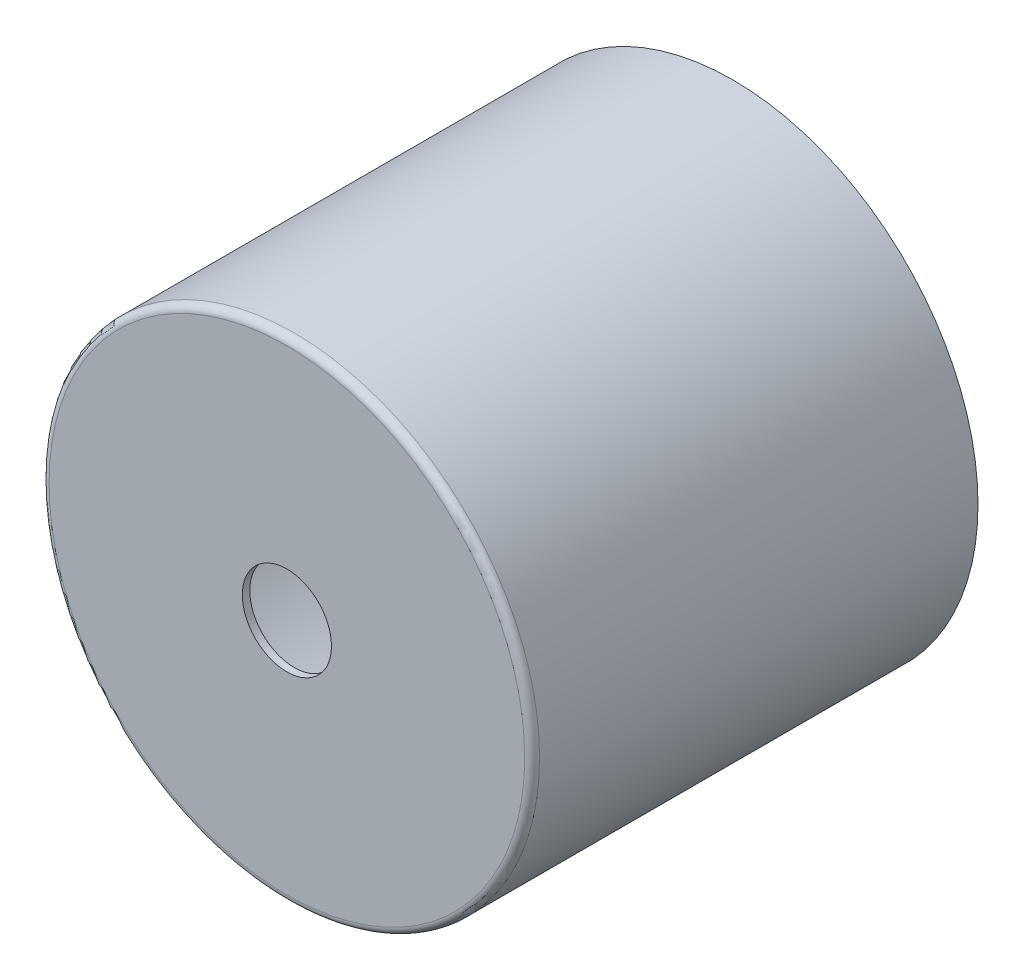
ISO-10303-21;
HEADER;
FILE_DESCRIPTION(('STEP AP214'),'2;1');
FILE_NAME('part.step','',(''),(''),'','','');
FILE_SCHEMA(('AUTOMOTIVE_DESIGN { 1 0 10303 214 1 1 1 1 }'));
ENDSEC;
DATA;
#1=APPLICATION_CONTEXT('core data for automotive mechanical design processes');
#2=APPLICATION_PROTOCOL_DEFINITION('international standard','automotive_design',2000,#1);
#3=PRODUCT_CONTEXT('',#1,'mechanical');
#4=PRODUCT('Part','Part','',(#3));
#5=PRODUCT_RELATED_PRODUCT_CATEGORY('part','',(#4));
#6=PRODUCT_DEFINITION_FORMATION('','',#4);
#7=PRODUCT_DEFINITION_CONTEXT('part definition',#1,'design');
#8=PRODUCT_DEFINITION('design','',#6,#7);
#9=PRODUCT_DEFINITION_SHAPE('','',#8);
#10=(LENGTH_UNIT() NAMED_UNIT(*) SI_UNIT(.MILLI.,.METRE.));
#11=(NAMED_UNIT(*) PLANE_ANGLE_UNIT() SI_UNIT($,.RADIAN.));
#12=(NAMED_UNIT(*) SI_UNIT($,.STERADIAN.) SOLID_ANGLE_UNIT());
#13=UNCERTAINTY_MEASURE_WITH_UNIT(LENGTH_MEASURE(1.E-05),#10,'distance_accuracy_value','');
#14=(GEOMETRIC_REPRESENTATION_CONTEXT(3) GLOBAL_UNCERTAINTY_ASSIGNED_CONTEXT((#13)) GLOBAL_UNIT_ASSIGNED_CONTEXT((#10,
#11,#12)) REPRESENTATION_CONTEXT('',''));
#15=CARTESIAN_POINT('',(0.,0.,0.));
#16=DIRECTION('',(0.,0.,1.));
#17=DIRECTION('',(1.,0.,0.));
#18=AXIS2_PLACEMENT_3D('',#15,#16,#17);
#19=CARTESIAN_POINT('',(0.,0.,-30.));
#20=DIRECTION('',(0.,0.,1.));
#21=DIRECTION('',(1.,0.,0.));
#22=AXIS2_PLACEMENT_3D('',#19,#20,#21);
#23=CYLINDRICAL_SURFACE('',#22,16.5);
#24=CARTESIAN_POINT('',(0.,0.,-0.5));
#25=DIRECTION('',(0.,0.,1.));
#26=DIRECTION('',(1.,0.,0.));
#27=AXIS2_PLACEMENT_3D('',#24,#25,#26);
#28=CIRCLE('',#27,16.5);
#29=CARTESIAN_POINT('',(16.5,0.,-0.5));
#30=VERTEX_POINT('',#29);
#31=EDGE_CURVE('E10',#30,#30,#28,.F.);
#32=ORIENTED_EDGE('',*,*,#31,.T.);
#33=EDGE_LOOP('',(#32));
#34=FACE_BOUND('',#33,.T.);
#35=CARTESIAN_POINT('',(0.,0.,-30.));
#36=DIRECTION('',(0.,0.,1.));
#37=DIRECTION('',(1.,0.,0.));
#38=AXIS2_PLACEMENT_3D('',#35,#36,#37);
#39=CIRCLE('',#38,16.5);
#40=CARTESIAN_POINT('',(16.5,0.,-30.));
#41=VERTEX_POINT('',#40);
#42=EDGE_CURVE('E44',#41,#41,#39,.T.);
#43=ORIENTED_EDGE('',*,*,#42,.T.);
#44=EDGE_LOOP('',(#43));
#45=FACE_BOUND('',#44,.T.);
#46=ADVANCED_FACE('F33',(#34,#45),#23,.T.);
#47=CARTESIAN_POINT('',(0.,0.,-30.));
#48=DIRECTION('',(0.,0.,1.));
#49=DIRECTION('',(1.,0.,0.));
#50=AXIS2_PLACEMENT_3D('',#47,#48,#49);
#51=PLANE('',#50);
#52=CARTESIAN_POINT('',(0.,0.,-30.));
#53=DIRECTION('',(0.,0.,1.));
#54=DIRECTION('',(1.,0.,0.));
#55=AXIS2_PLACEMENT_3D('',#52,#53,#54);
#56=CIRCLE('',#55,16.);
#57=CARTESIAN_POINT('',(16.,0.,-30.));
#58=VERTEX_POINT('',#57);
#59=EDGE_CURVE('E48',#58,#58,#56,.T.);
#60=ORIENTED_EDGE('',*,*,#59,.T.);
#61=EDGE_LOOP('',(#60));
#62=FACE_BOUND('',#61,.T.);
#63=ORIENTED_EDGE('',*,*,#42,.F.);
#64=EDGE_LOOP('',(#63));
#65=FACE_BOUND('',#64,.T.);
#66=ADVANCED_FACE('F69',(#62,#65),#51,.F.);
#67=CARTESIAN_POINT('',(0.,0.,0.));
#68=DIRECTION('',(0.,0.,1.));
#69=DIRECTION('',(1.,0.,0.));
#70=AXIS2_PLACEMENT_3D('',#67,#68,#69);
#71=PLANE('',#70);
#72=CARTESIAN_POINT('',(0.,0.,0.));
#73=DIRECTION('',(0.,0.,1.));
#74=DIRECTION('',(1.,0.,0.));
#75=AXIS2_PLACEMENT_3D('',#72,#73,#74);
#76=CIRCLE('',#75,16.);
#77=CARTESIAN_POINT('',(16.,0.,0.));
#78=VERTEX_POINT('',#77);
#79=EDGE_CURVE('E40',#78,#78,#76,.T.);
#80=ORIENTED_EDGE('',*,*,#79,.T.);
#81=EDGE_LOOP('',(#80));
#82=FACE_BOUND('',#81,.T.);
#83=CARTESIAN_POINT('',(0.,0.,0.));
#84=DIRECTION('',(0.,0.,1.));
#85=DIRECTION('',(1.,0.,0.));
#86=AXIS2_PLACEMENT_3D('',#83,#84,#85);
#87=CIRCLE('',#86,3.);
#88=CARTESIAN_POINT('',(3.,0.,0.));
#89=VERTEX_POINT('',#88);
#90=EDGE_CURVE('E54',#89,#89,#87,.T.);
#91=ORIENTED_EDGE('',*,*,#90,.F.);
#92=EDGE_LOOP('',(#91));
#93=FACE_BOUND('',#92,.T.);
#94=ADVANCED_FACE('F66',(#82,#93),#71,.T.);
#95=CARTESIAN_POINT('',(0.,0.,-30.));
#96=DIRECTION('',(0.,0.,1.));
#97=DIRECTION('',(1.,0.,0.));
#98=AXIS2_PLACEMENT_3D('',#95,#96,#97);
#99=CYLINDRICAL_SURFACE('',#98,16.);
#100=ORIENTED_EDGE('',*,*,#59,.F.);
#101=EDGE_LOOP('',(#100));
#102=FACE_BOUND('',#101,.T.);
#103=CARTESIAN_POINT('',(0.,0.,-0.5));
#104=DIRECTION('',(0.,0.,1.));
#105=DIRECTION('',(1.,0.,0.));
#106=AXIS2_PLACEMENT_3D('',#103,#104,#105);
#107=CIRCLE('',#106,16.);
#108=CARTESIAN_POINT('',(16.,0.,-0.5));
#109=VERTEX_POINT('',#108);
#110=EDGE_CURVE('E53',#109,#109,#107,.T.);
#111=ORIENTED_EDGE('',*,*,#110,.T.);
#112=EDGE_LOOP('',(#111));
#113=FACE_BOUND('',#112,.T.);
#114=ADVANCED_FACE('F68',(#102,#113),#99,.F.);
#115=CARTESIAN_POINT('',(0.,0.,-0.5));
#116=DIRECTION('',(0.,0.,1.));
#117=DIRECTION('',(1.,0.,0.));
#118=AXIS2_PLACEMENT_3D('',#115,#116,#117);
#119=PLANE('',#118);
#120=CARTESIAN_POINT('',(0.,0.,-0.5));
#121=DIRECTION('',(0.,0.,1.));
#122=DIRECTION('',(1.,0.,0.));
#123=AXIS2_PLACEMENT_3D('',#120,#121,#122);
#124=CIRCLE('',#123,3.);
#125=CARTESIAN_POINT('',(3.,0.,-0.5));
#126=VERTEX_POINT('',#125);
#127=EDGE_CURVE('E51',#126,#126,#124,.T.);
#128=ORIENTED_EDGE('',*,*,#127,.T.);
#129=EDGE_LOOP('',(#128));
#130=FACE_BOUND('',#129,.T.);
#131=ORIENTED_EDGE('',*,*,#110,.F.);
#132=EDGE_LOOP('',(#131));
#133=FACE_BOUND('',#132,.T.);
#134=ADVANCED_FACE('F75',(#130,#133),#119,.F.);
#135=CARTESIAN_POINT('',(0.,0.,-30.));
#136=DIRECTION('',(0.,0.,1.));
#137=DIRECTION('',(1.,0.,0.));
#138=AXIS2_PLACEMENT_3D('',#135,#136,#137);
#139=CYLINDRICAL_SURFACE('',#138,3.);
#140=ORIENTED_EDGE('',*,*,#90,.T.);
#141=EDGE_LOOP('',(#140));
#142=FACE_BOUND('',#141,.T.);
#143=ORIENTED_EDGE('',*,*,#127,.F.);
#144=EDGE_LOOP('',(#143));
#145=FACE_BOUND('',#144,.T.);
#146=ADVANCED_FACE('F63',(#142,#145),#139,.F.);
#147=CARTESIAN_POINT('',(0.,0.,-0.5));
#148=DIRECTION('',(0.,0.,1.));
#149=DIRECTION('',(1.,0.,0.));
#150=AXIS2_PLACEMENT_3D('',#147,#148,#149);
#151=TOROIDAL_SURFACE('',#150,16.,0.5);
#152=ORIENTED_EDGE('',*,*,#31,.F.);
#153=EDGE_LOOP('',(#152));
#154=FACE_BOUND('',#153,.T.);
#155=ORIENTED_EDGE('',*,*,#79,.F.);
#156=EDGE_LOOP('',(#155));
#157=FACE_BOUND('',#156,.T.);
#158=ADVANCED_FACE('F35',(#154,#157),#151,.T.);
#159=CLOSED_SHELL('',(#46,#66,#94,#114,#134,#146,#158));
#160=MANIFOLD_SOLID_BREP('B2',#159);
#161=ADVANCED_BREP_SHAPE_REPRESENTATION('',(#18,#160),#14);
#162=SHAPE_DEFINITION_REPRESENTATION(#9,#161);
ENDSEC;
END-ISO-10303-21;
